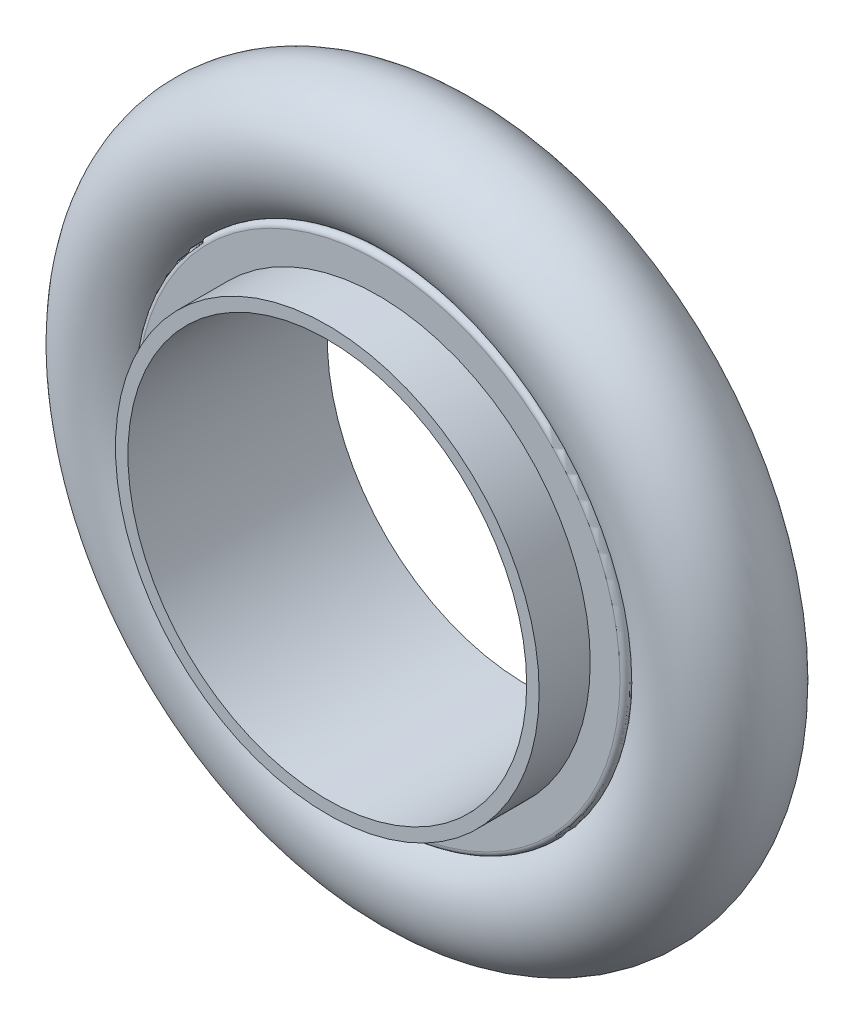
ISO-10303-21;
HEADER;
FILE_DESCRIPTION(('STEP AP214'),'2;1');
FILE_NAME('part.step','',(''),(''),'','','');
FILE_SCHEMA(('AUTOMOTIVE_DESIGN { 1 0 10303 214 1 1 1 1 }'));
ENDSEC;
DATA;
#1=APPLICATION_CONTEXT('core data for automotive mechanical design processes');
#2=APPLICATION_PROTOCOL_DEFINITION('international standard','automotive_design',2000,#1);
#3=PRODUCT_CONTEXT('',#1,'mechanical');
#4=PRODUCT('Part','Part','',(#3));
#5=PRODUCT_RELATED_PRODUCT_CATEGORY('part','',(#4));
#6=PRODUCT_DEFINITION_FORMATION('','',#4);
#7=PRODUCT_DEFINITION_CONTEXT('part definition',#1,'design');
#8=PRODUCT_DEFINITION('design','',#6,#7);
#9=PRODUCT_DEFINITION_SHAPE('','',#8);
#10=(LENGTH_UNIT() NAMED_UNIT(*) SI_UNIT(.MILLI.,.METRE.));
#11=(NAMED_UNIT(*) PLANE_ANGLE_UNIT() SI_UNIT($,.RADIAN.));
#12=(NAMED_UNIT(*) SI_UNIT($,.STERADIAN.) SOLID_ANGLE_UNIT());
#13=UNCERTAINTY_MEASURE_WITH_UNIT(LENGTH_MEASURE(1.E-05),#10,'distance_accuracy_value','');
#14=(GEOMETRIC_REPRESENTATION_CONTEXT(3) GLOBAL_UNCERTAINTY_ASSIGNED_CONTEXT((#13)) GLOBAL_UNIT_ASSIGNED_CONTEXT((#10,
#11,#12)) REPRESENTATION_CONTEXT('',''));
#15=CARTESIAN_POINT('',(0.,0.,0.));
#16=DIRECTION('',(0.,0.,1.));
#17=DIRECTION('',(1.,0.,0.));
#18=AXIS2_PLACEMENT_3D('',#15,#16,#17);
#19=CARTESIAN_POINT('',(0.,8.5,-4.));
#20=DIRECTION('',(0.,0.,1.));
#21=DIRECTION('',(1.,0.,0.));
#22=AXIS2_PLACEMENT_3D('',#19,#20,#21);
#23=PLANE('',#22);
#24=CARTESIAN_POINT('',(0.,0.,-4.));
#25=DIRECTION('',(0.,0.,-1.));
#26=DIRECTION('',(-1.,0.,0.));
#27=AXIS2_PLACEMENT_3D('',#24,#25,#26);
#28=CIRCLE('',#27,8.);
#29=CARTESIAN_POINT('',(8.,0.,-4.));
#30=VERTEX_POINT('',#29);
#31=EDGE_CURVE('E11',#30,#30,#28,.T.);
#32=ORIENTED_EDGE('',*,*,#31,.F.);
#33=EDGE_LOOP('',(#32));
#34=FACE_BOUND('',#33,.T.);
#35=CARTESIAN_POINT('',(0.,0.,-4.));
#36=DIRECTION('',(0.,0.,-1.));
#37=DIRECTION('',(-1.,0.,0.));
#38=AXIS2_PLACEMENT_3D('',#35,#36,#37);
#39=CIRCLE('',#38,8.5);
#40=CARTESIAN_POINT('',(8.5,0.,-4.));
#41=VERTEX_POINT('',#40);
#42=EDGE_CURVE('E93',#41,#41,#39,.T.);
#43=ORIENTED_EDGE('',*,*,#42,.T.);
#44=EDGE_LOOP('',(#43));
#45=FACE_BOUND('',#44,.T.);
#46=ADVANCED_FACE('F17',(#34,#45),#23,.F.);
#47=CARTESIAN_POINT('',(0.,8.5,-1.95));
#48=DIRECTION('',(0.,0.,1.));
#49=DIRECTION('',(1.,0.,0.));
#50=AXIS2_PLACEMENT_3D('',#47,#48,#49);
#51=PLANE('',#50);
#52=CARTESIAN_POINT('',(0.,0.,-1.95));
#53=DIRECTION('',(0.,0.,-1.));
#54=DIRECTION('',(-1.,0.,0.));
#55=AXIS2_PLACEMENT_3D('',#52,#53,#54);
#56=CIRCLE('',#55,8.5);
#57=CARTESIAN_POINT('',(8.5,0.,-1.95));
#58=VERTEX_POINT('',#57);
#59=EDGE_CURVE('E84',#58,#58,#56,.T.);
#60=ORIENTED_EDGE('',*,*,#59,.F.);
#61=EDGE_LOOP('',(#60));
#62=FACE_BOUND('',#61,.T.);
#63=CARTESIAN_POINT('',(0.,0.,-1.95));
#64=DIRECTION('',(0.,0.,-1.));
#65=DIRECTION('',(1.,0.,0.));
#66=AXIS2_PLACEMENT_3D('',#63,#64,#65);
#67=CIRCLE('',#66,9.69391148050479);
#68=CARTESIAN_POINT('',(9.69391148050479,0.,-1.95));
#69=VERTEX_POINT('',#68);
#70=EDGE_CURVE('E117',#69,#69,#67,.T.);
#71=ORIENTED_EDGE('',*,*,#70,.T.);
#72=EDGE_LOOP('',(#71));
#73=FACE_BOUND('',#72,.T.);
#74=ADVANCED_FACE('F166',(#62,#73),#51,.F.);
#75=CARTESIAN_POINT('',(0.,10.1855512152838,1.95));
#76=DIRECTION('',(0.,0.,-1.));
#77=DIRECTION('',(0.,-1.,0.));
#78=AXIS2_PLACEMENT_3D('',#75,#76,#77);
#79=PLANE('',#78);
#80=CARTESIAN_POINT('',(0.,0.,1.95));
#81=DIRECTION('',(0.,0.,-1.));
#82=DIRECTION('',(-1.,0.,0.));
#83=AXIS2_PLACEMENT_3D('',#80,#81,#82);
#84=CIRCLE('',#83,8.5);
#85=CARTESIAN_POINT('',(8.5,0.,1.95));
#86=VERTEX_POINT('',#85);
#87=EDGE_CURVE('E112',#86,#86,#84,.T.);
#88=ORIENTED_EDGE('',*,*,#87,.T.);
#89=EDGE_LOOP('',(#88));
#90=FACE_BOUND('',#89,.T.);
#91=CARTESIAN_POINT('',(0.,0.,1.95));
#92=DIRECTION('',(0.,0.,1.));
#93=DIRECTION('',(-1.,0.,0.));
#94=AXIS2_PLACEMENT_3D('',#91,#92,#93);
#95=CIRCLE('',#94,9.69391148050479);
#96=CARTESIAN_POINT('',(-9.69391148050479,0.,1.95));
#97=VERTEX_POINT('',#96);
#98=EDGE_CURVE('E103',#97,#97,#95,.T.);
#99=ORIENTED_EDGE('',*,*,#98,.T.);
#100=EDGE_LOOP('',(#99));
#101=FACE_BOUND('',#100,.T.);
#102=ADVANCED_FACE('F162',(#90,#101),#79,.F.);
#103=CARTESIAN_POINT('',(0.,8.,4.));
#104=DIRECTION('',(0.,0.,-1.));
#105=DIRECTION('',(0.,-1.,0.));
#106=AXIS2_PLACEMENT_3D('',#103,#104,#105);
#107=PLANE('',#106);
#108=CARTESIAN_POINT('',(0.,0.,4.));
#109=DIRECTION('',(0.,0.,-1.));
#110=DIRECTION('',(-1.,0.,0.));
#111=AXIS2_PLACEMENT_3D('',#108,#109,#110);
#112=CIRCLE('',#111,8.);
#113=CARTESIAN_POINT('',(8.,0.,4.));
#114=VERTEX_POINT('',#113);
#115=EDGE_CURVE('E130',#114,#114,#112,.T.);
#116=ORIENTED_EDGE('',*,*,#115,.T.);
#117=EDGE_LOOP('',(#116));
#118=FACE_BOUND('',#117,.T.);
#119=CARTESIAN_POINT('',(0.,0.,4.));
#120=DIRECTION('',(0.,0.,-1.));
#121=DIRECTION('',(-1.,0.,0.));
#122=AXIS2_PLACEMENT_3D('',#119,#120,#121);
#123=CIRCLE('',#122,8.5);
#124=CARTESIAN_POINT('',(8.5,0.,4.));
#125=VERTEX_POINT('',#124);
#126=EDGE_CURVE('E127',#125,#125,#123,.T.);
#127=ORIENTED_EDGE('',*,*,#126,.F.);
#128=EDGE_LOOP('',(#127));
#129=FACE_BOUND('',#128,.T.);
#130=ADVANCED_FACE('F19',(#118,#129),#107,.F.);
#131=CARTESIAN_POINT('',(0.,0.,0.));
#132=DIRECTION('',(0.,0.,-1.));
#133=DIRECTION('',(-1.,0.,0.));
#134=AXIS2_PLACEMENT_3D('',#131,#132,#133);
#135=CYLINDRICAL_SURFACE('',#134,8.);
#136=ORIENTED_EDGE('',*,*,#115,.F.);
#137=DIRECTION('',(0.,0.,-1.));
#138=VECTOR('',#137,1.);
#139=CARTESIAN_POINT('',(8.,0.,0.));
#140=LINE('',#139,#138);
#141=EDGE_CURVE('E27',#114,#30,#140,.T.);
#142=ORIENTED_EDGE('',*,*,#141,.T.);
#143=ORIENTED_EDGE('',*,*,#31,.T.);
#144=ORIENTED_EDGE('',*,*,#141,.F.);
#145=EDGE_LOOP('',(#136,#142,#143,#144));
#146=FACE_BOUND('',#145,.T.);
#147=ADVANCED_FACE('F151',(#146),#135,.F.);
#148=CARTESIAN_POINT('',(0.,0.,0.));
#149=DIRECTION('',(0.,0.,-1.));
#150=DIRECTION('',(-1.,0.,0.));
#151=AXIS2_PLACEMENT_3D('',#148,#149,#150);
#152=CYLINDRICAL_SURFACE('',#151,8.5);
#153=ORIENTED_EDGE('',*,*,#87,.F.);
#154=DIRECTION('',(0.,0.,1.));
#155=VECTOR('',#154,1.);
#156=CARTESIAN_POINT('',(8.5,0.,0.));
#157=LINE('',#156,#155);
#158=EDGE_CURVE('E116',#86,#125,#157,.T.);
#159=ORIENTED_EDGE('',*,*,#158,.T.);
#160=ORIENTED_EDGE('',*,*,#126,.T.);
#161=ORIENTED_EDGE('',*,*,#158,.F.);
#162=EDGE_LOOP('',(#153,#159,#160,#161));
#163=FACE_BOUND('',#162,.T.);
#164=ADVANCED_FACE('F153',(#163),#152,.T.);
#165=CARTESIAN_POINT('',(0.,0.,0.));
#166=DIRECTION('',(0.,0.,-1.));
#167=DIRECTION('',(-1.,0.,0.));
#168=AXIS2_PLACEMENT_3D('',#165,#166,#167);
#169=CYLINDRICAL_SURFACE('',#168,8.5);
#170=ORIENTED_EDGE('',*,*,#42,.F.);
#171=DIRECTION('',(0.,0.,1.));
#172=VECTOR('',#171,1.);
#173=CARTESIAN_POINT('',(8.5,0.,0.));
#174=LINE('',#173,#172);
#175=EDGE_CURVE('E90',#41,#58,#174,.T.);
#176=ORIENTED_EDGE('',*,*,#175,.T.);
#177=ORIENTED_EDGE('',*,*,#59,.T.);
#178=ORIENTED_EDGE('',*,*,#175,.F.);
#179=EDGE_LOOP('',(#170,#176,#177,#178));
#180=FACE_BOUND('',#179,.T.);
#181=ADVANCED_FACE('F92',(#180),#169,.T.);
#182=CARTESIAN_POINT('',(0.,0.,1.75));
#183=DIRECTION('',(0.,0.,1.));
#184=DIRECTION('',(1.,0.,0.));
#185=AXIS2_PLACEMENT_3D('',#182,#183,#184);
#186=TOROIDAL_SURFACE('',#185,9.69391148050479,0.2);
#187=ORIENTED_EDGE('',*,*,#98,.F.);
#188=CARTESIAN_POINT('',(-9.69391148050479,0.,1.75));
#189=DIRECTION('',(0.,-1.,0.));
#190=DIRECTION('',(-1.,0.,0.));
#191=AXIS2_PLACEMENT_3D('',#188,#189,#190);
#192=CIRCLE('',#191,0.2);
#193=CARTESIAN_POINT('',(-9.84621433380073,0.,1.62037037037037));
#194=VERTEX_POINT('',#193);
#195=EDGE_CURVE('E72',#97,#194,#192,.T.);
#196=ORIENTED_EDGE('',*,*,#195,.T.);
#197=CARTESIAN_POINT('',(0.,0.,1.62037037037037));
#198=DIRECTION('',(0.,0.,-1.));
#199=DIRECTION('',(-1.,0.,0.));
#200=AXIS2_PLACEMENT_3D('',#197,#198,#199);
#201=CIRCLE('',#200,9.84621433380073);
#202=CARTESIAN_POINT('',(9.84621433380073,0.,1.62037037037037));
#203=VERTEX_POINT('',#202);
#204=EDGE_CURVE('E110',#203,#194,#201,.T.);
#205=ORIENTED_EDGE('',*,*,#204,.F.);
#206=CARTESIAN_POINT('',(0.,0.,1.62037037037037));
#207=DIRECTION('',(0.,0.,-1.));
#208=DIRECTION('',(-1.,0.,0.));
#209=AXIS2_PLACEMENT_3D('',#206,#207,#208);
#210=CIRCLE('',#209,9.84621433380073);
#211=EDGE_CURVE('E120',#194,#203,#210,.T.);
#212=ORIENTED_EDGE('',*,*,#211,.F.);
#213=ORIENTED_EDGE('',*,*,#195,.F.);
#214=EDGE_LOOP('',(#187,#196,#205,#212,#213));
#215=FACE_BOUND('',#214,.T.);
#216=ADVANCED_FACE('F180',(#215),#186,.T.);
#217=CARTESIAN_POINT('',(0.,0.,-1.75));
#218=DIRECTION('',(0.,0.,-1.));
#219=DIRECTION('',(-1.,0.,0.));
#220=AXIS2_PLACEMENT_3D('',#217,#218,#219);
#221=TOROIDAL_SURFACE('',#220,9.69391148050479,0.2);
#222=ORIENTED_EDGE('',*,*,#70,.F.);
#223=CARTESIAN_POINT('',(9.69391148050479,0.,-1.75));
#224=DIRECTION('',(0.,-1.,0.));
#225=DIRECTION('',(1.,0.,0.));
#226=AXIS2_PLACEMENT_3D('',#223,#224,#225);
#227=CIRCLE('',#226,0.2);
#228=CARTESIAN_POINT('',(9.84621433380073,0.,-1.62037037037037));
#229=VERTEX_POINT('',#228);
#230=EDGE_CURVE('E59',#69,#229,#227,.T.);
#231=ORIENTED_EDGE('',*,*,#230,.T.);
#232=CARTESIAN_POINT('',(0.,0.,-1.62037037037037));
#233=DIRECTION('',(0.,0.,1.));
#234=DIRECTION('',(1.,0.,0.));
#235=AXIS2_PLACEMENT_3D('',#232,#233,#234);
#236=CIRCLE('',#235,9.84621433380073);
#237=EDGE_CURVE('E111',#229,#229,#236,.T.);
#238=ORIENTED_EDGE('',*,*,#237,.F.);
#239=ORIENTED_EDGE('',*,*,#230,.F.);
#240=EDGE_LOOP('',(#222,#231,#238,#239));
#241=FACE_BOUND('',#240,.T.);
#242=ADVANCED_FACE('F177',(#241),#221,.T.);
#243=CARTESIAN_POINT('',(0.,0.,0.));
#244=DIRECTION('',(0.,0.,-1.));
#245=DIRECTION('',(-1.,0.,0.));
#246=AXIS2_PLACEMENT_3D('',#243,#244,#245);
#247=TOROIDAL_SURFACE('',#246,11.75,2.5);
#248=ORIENTED_EDGE('',*,*,#237,.T.);
#249=CARTESIAN_POINT('',(11.75,0.,0.));
#250=DIRECTION('',(0.,-1.,0.));
#251=DIRECTION('',(1.,0.,0.));
#252=AXIS2_PLACEMENT_3D('',#249,#250,#251);
#253=CIRCLE('',#252,2.5);
#254=EDGE_CURVE('E106',#229,#203,#253,.T.);
#255=ORIENTED_EDGE('',*,*,#254,.T.);
#256=ORIENTED_EDGE('',*,*,#204,.T.);
#257=ORIENTED_EDGE('',*,*,#211,.T.);
#258=ORIENTED_EDGE('',*,*,#254,.F.);
#259=EDGE_LOOP('',(#248,#255,#256,#257,#258));
#260=FACE_BOUND('',#259,.T.);
#261=ADVANCED_FACE('F175',(#260),#247,.T.);
#262=CLOSED_SHELL('',(#46,#74,#102,#130,#147,#164,#181,#216,#242,#261));
#263=MANIFOLD_SOLID_BREP('B1',#262);
#264=ADVANCED_BREP_SHAPE_REPRESENTATION('',(#18,#263),#14);
#265=SHAPE_DEFINITION_REPRESENTATION(#9,#264);
ENDSEC;
END-ISO-10303-21;
